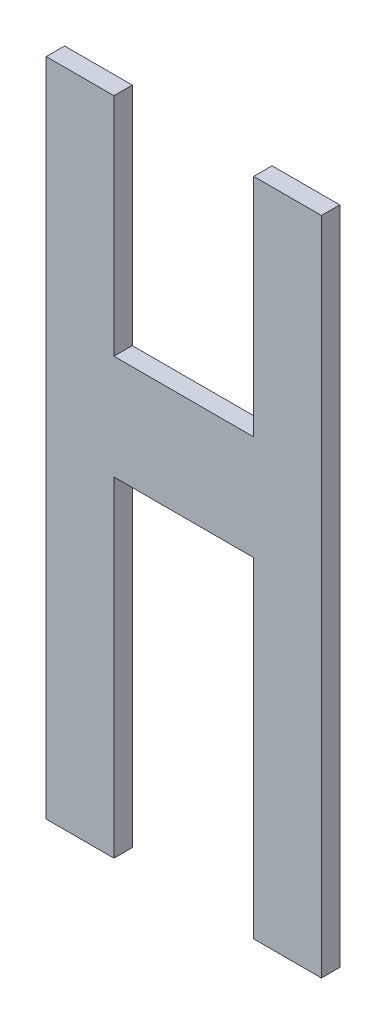
ISO-10303-21;
HEADER;
FILE_DESCRIPTION(('STEP AP214'),'2;1');
FILE_NAME('part.step','',(''),(''),'','','');
FILE_SCHEMA(('AUTOMOTIVE_DESIGN { 1 0 10303 214 1 1 1 1 }'));
ENDSEC;
DATA;
#1=APPLICATION_CONTEXT('core data for automotive mechanical design processes');
#2=APPLICATION_PROTOCOL_DEFINITION('international standard','automotive_design',2000,#1);
#3=PRODUCT_CONTEXT('',#1,'mechanical');
#4=PRODUCT('Part','Part','',(#3));
#5=PRODUCT_RELATED_PRODUCT_CATEGORY('part','',(#4));
#6=PRODUCT_DEFINITION_FORMATION('','',#4);
#7=PRODUCT_DEFINITION_CONTEXT('part definition',#1,'design');
#8=PRODUCT_DEFINITION('design','',#6,#7);
#9=PRODUCT_DEFINITION_SHAPE('','',#8);
#10=(LENGTH_UNIT() NAMED_UNIT(*) SI_UNIT(.MILLI.,.METRE.));
#11=(NAMED_UNIT(*) PLANE_ANGLE_UNIT() SI_UNIT($,.RADIAN.));
#12=(NAMED_UNIT(*) SI_UNIT($,.STERADIAN.) SOLID_ANGLE_UNIT());
#13=UNCERTAINTY_MEASURE_WITH_UNIT(LENGTH_MEASURE(1.E-05),#10,'distance_accuracy_value','');
#14=(GEOMETRIC_REPRESENTATION_CONTEXT(3) GLOBAL_UNCERTAINTY_ASSIGNED_CONTEXT((#13)) GLOBAL_UNIT_ASSIGNED_CONTEXT((#10,
#11,#12)) REPRESENTATION_CONTEXT('',''));
#15=CARTESIAN_POINT('',(0.,0.,0.));
#16=DIRECTION('',(0.,0.,1.));
#17=DIRECTION('',(1.,0.,0.));
#18=AXIS2_PLACEMENT_3D('',#15,#16,#17);
#19=CARTESIAN_POINT('',(-335.788761354376,508.440170454545,25.4));
#20=DIRECTION('',(0.,-1.,0.));
#21=DIRECTION('',(0.,0.,-1.));
#22=AXIS2_PLACEMENT_3D('',#19,#20,#21);
#23=PLANE('',#22);
#24=DIRECTION('',(-1.,0.,0.));
#25=VECTOR('',#24,1.);
#26=CARTESIAN_POINT('',(-335.788761354376,508.440170454545,0.));
#27=LINE('',#26,#25);
#28=CARTESIAN_POINT('',(-335.788761354376,508.440170454545,0.));
#29=VERTEX_POINT('',#28);
#30=CARTESIAN_POINT('',(-429.514761354376,508.440170454545,0.));
#31=VERTEX_POINT('',#30);
#32=EDGE_CURVE('E153',#29,#31,#27,.T.);
#33=ORIENTED_EDGE('',*,*,#32,.T.);
#34=DIRECTION('',(0.,0.,-1.));
#35=VECTOR('',#34,1.);
#36=CARTESIAN_POINT('',(-429.514761354376,508.440170454545,25.4));
#37=LINE('',#36,#35);
#38=CARTESIAN_POINT('',(-429.514761354376,508.440170454545,25.4));
#39=VERTEX_POINT('',#38);
#40=EDGE_CURVE('E11',#39,#31,#37,.T.);
#41=ORIENTED_EDGE('',*,*,#40,.F.);
#42=DIRECTION('',(-1.,0.,0.));
#43=VECTOR('',#42,1.);
#44=CARTESIAN_POINT('',(-335.788761354376,508.440170454545,25.4));
#45=LINE('',#44,#43);
#46=CARTESIAN_POINT('',(-335.788761354376,508.440170454545,25.4));
#47=VERTEX_POINT('',#46);
#48=EDGE_CURVE('E175',#47,#39,#45,.T.);
#49=ORIENTED_EDGE('',*,*,#48,.F.);
#50=DIRECTION('',(0.,0.,-1.));
#51=VECTOR('',#50,1.);
#52=CARTESIAN_POINT('',(-335.788761354376,508.440170454545,25.4));
#53=LINE('',#52,#51);
#54=EDGE_CURVE('E149',#47,#29,#53,.T.);
#55=ORIENTED_EDGE('',*,*,#54,.T.);
#56=EDGE_LOOP('',(#33,#41,#49,#55));
#57=FACE_BOUND('',#56,.T.);
#58=ADVANCED_FACE('F33',(#57),#23,.F.);
#59=CARTESIAN_POINT('',(-429.514761354376,508.440170454545,25.4));
#60=DIRECTION('',(1.,0.,0.));
#61=DIRECTION('',(0.,1.,0.));
#62=AXIS2_PLACEMENT_3D('',#59,#60,#61);
#63=PLANE('',#62);
#64=DIRECTION('',(0.,-1.,0.));
#65=VECTOR('',#64,1.);
#66=CARTESIAN_POINT('',(-429.514761354376,508.440170454545,0.));
#67=LINE('',#66,#65);
#68=CARTESIAN_POINT('',(-429.514761354376,-405.959829545455,0.));
#69=VERTEX_POINT('',#68);
#70=EDGE_CURVE('E156',#31,#69,#67,.T.);
#71=ORIENTED_EDGE('',*,*,#70,.T.);
#72=DIRECTION('',(0.,0.,-1.));
#73=VECTOR('',#72,1.);
#74=CARTESIAN_POINT('',(-429.514761354376,-405.959829545455,25.4));
#75=LINE('',#74,#73);
#76=CARTESIAN_POINT('',(-429.514761354376,-405.959829545455,25.4));
#77=VERTEX_POINT('',#76);
#78=EDGE_CURVE('E41',#77,#69,#75,.T.);
#79=ORIENTED_EDGE('',*,*,#78,.F.);
#80=DIRECTION('',(0.,-1.,0.));
#81=VECTOR('',#80,1.);
#82=CARTESIAN_POINT('',(-429.514761354376,508.440170454545,25.4));
#83=LINE('',#82,#81);
#84=EDGE_CURVE('E104',#39,#77,#83,.T.);
#85=ORIENTED_EDGE('',*,*,#84,.F.);
#86=ORIENTED_EDGE('',*,*,#40,.T.);
#87=EDGE_LOOP('',(#71,#79,#85,#86));
#88=FACE_BOUND('',#87,.T.);
#89=ADVANCED_FACE('F253',(#88),#63,.F.);
#90=CARTESIAN_POINT('',(-429.514761354376,-405.959829545455,25.4));
#91=DIRECTION('',(0.,1.,0.));
#92=DIRECTION('',(0.,0.,1.));
#93=AXIS2_PLACEMENT_3D('',#90,#91,#92);
#94=PLANE('',#93);
#95=DIRECTION('',(1.,0.,0.));
#96=VECTOR('',#95,1.);
#97=CARTESIAN_POINT('',(-429.514761354376,-405.959829545455,0.));
#98=LINE('',#97,#96);
#99=CARTESIAN_POINT('',(-335.788761354376,-405.959829545455,0.));
#100=VERTEX_POINT('',#99);
#101=EDGE_CURVE('E158',#69,#100,#98,.T.);
#102=ORIENTED_EDGE('',*,*,#101,.T.);
#103=DIRECTION('',(0.,0.,-1.));
#104=VECTOR('',#103,1.);
#105=CARTESIAN_POINT('',(-335.788761354376,-405.959829545455,25.4));
#106=LINE('',#105,#104);
#107=CARTESIAN_POINT('',(-335.788761354376,-405.959829545455,25.4));
#108=VERTEX_POINT('',#107);
#109=EDGE_CURVE('E194',#108,#100,#106,.T.);
#110=ORIENTED_EDGE('',*,*,#109,.F.);
#111=DIRECTION('',(1.,0.,0.));
#112=VECTOR('',#111,1.);
#113=CARTESIAN_POINT('',(-429.514761354376,-405.959829545455,25.4));
#114=LINE('',#113,#112);
#115=EDGE_CURVE('E202',#77,#108,#114,.T.);
#116=ORIENTED_EDGE('',*,*,#115,.F.);
#117=ORIENTED_EDGE('',*,*,#78,.T.);
#118=EDGE_LOOP('',(#102,#110,#116,#117));
#119=FACE_BOUND('',#118,.T.);
#120=ADVANCED_FACE('F200',(#119),#94,.F.);
#121=CARTESIAN_POINT('',(-335.788761354376,-405.959829545455,25.4));
#122=DIRECTION('',(-1.,0.,0.));
#123=DIRECTION('',(0.,0.,1.));
#124=AXIS2_PLACEMENT_3D('',#121,#122,#123);
#125=PLANE('',#124);
#126=DIRECTION('',(0.,1.,0.));
#127=VECTOR('',#126,1.);
#128=CARTESIAN_POINT('',(-335.788761354376,-405.959829545455,0.));
#129=LINE('',#128,#127);
#130=CARTESIAN_POINT('',(-335.788761354376,51.2401704545454,0.));
#131=VERTEX_POINT('',#130);
#132=EDGE_CURVE('E160',#100,#131,#129,.T.);
#133=ORIENTED_EDGE('',*,*,#132,.T.);
#134=DIRECTION('',(0.,0.,-1.));
#135=VECTOR('',#134,1.);
#136=CARTESIAN_POINT('',(-335.788761354376,51.2401704545454,25.4));
#137=LINE('',#136,#135);
#138=CARTESIAN_POINT('',(-335.788761354376,51.2401704545454,25.4));
#139=VERTEX_POINT('',#138);
#140=EDGE_CURVE('E191',#139,#131,#137,.T.);
#141=ORIENTED_EDGE('',*,*,#140,.F.);
#142=DIRECTION('',(0.,1.,0.));
#143=VECTOR('',#142,1.);
#144=CARTESIAN_POINT('',(-335.788761354376,-405.959829545455,25.4));
#145=LINE('',#144,#143);
#146=EDGE_CURVE('E220',#108,#139,#145,.T.);
#147=ORIENTED_EDGE('',*,*,#146,.F.);
#148=ORIENTED_EDGE('',*,*,#109,.T.);
#149=EDGE_LOOP('',(#133,#141,#147,#148));
#150=FACE_BOUND('',#149,.T.);
#151=ADVANCED_FACE('F211',(#150),#125,.F.);
#152=CARTESIAN_POINT('',(-335.788761354376,51.2401704545454,25.4));
#153=DIRECTION('',(0.,1.,0.));
#154=DIRECTION('',(0.,0.,1.));
#155=AXIS2_PLACEMENT_3D('',#152,#153,#154);
#156=PLANE('',#155);
#157=DIRECTION('',(1.,0.,0.));
#158=VECTOR('',#157,1.);
#159=CARTESIAN_POINT('',(-335.788761354376,51.2401704545454,0.));
#160=LINE('',#159,#158);
#161=CARTESIAN_POINT('',(-142.284056924376,51.2401704545454,0.));
#162=VERTEX_POINT('',#161);
#163=EDGE_CURVE('E162',#131,#162,#160,.T.);
#164=ORIENTED_EDGE('',*,*,#163,.T.);
#165=DIRECTION('',(0.,0.,-1.));
#166=VECTOR('',#165,1.);
#167=CARTESIAN_POINT('',(-142.284056924376,51.2401704545454,25.4));
#168=LINE('',#167,#166);
#169=CARTESIAN_POINT('',(-142.284056924376,51.2401704545454,25.4));
#170=VERTEX_POINT('',#169);
#171=EDGE_CURVE('E188',#170,#162,#168,.T.);
#172=ORIENTED_EDGE('',*,*,#171,.F.);
#173=DIRECTION('',(1.,0.,0.));
#174=VECTOR('',#173,1.);
#175=CARTESIAN_POINT('',(-335.788761354376,51.2401704545454,25.4));
#176=LINE('',#175,#174);
#177=EDGE_CURVE('E217',#139,#170,#176,.T.);
#178=ORIENTED_EDGE('',*,*,#177,.F.);
#179=ORIENTED_EDGE('',*,*,#140,.T.);
#180=EDGE_LOOP('',(#164,#172,#178,#179));
#181=FACE_BOUND('',#180,.T.);
#182=ADVANCED_FACE('F215',(#181),#156,.F.);
#183=CARTESIAN_POINT('',(-142.284056924376,51.2401704545454,25.4));
#184=DIRECTION('',(1.,0.,0.));
#185=DIRECTION('',(0.,0.,-1.));
#186=AXIS2_PLACEMENT_3D('',#183,#184,#185);
#187=PLANE('',#186);
#188=DIRECTION('',(0.,-1.,0.));
#189=VECTOR('',#188,1.);
#190=CARTESIAN_POINT('',(-142.284056924376,51.2401704545454,0.));
#191=LINE('',#190,#189);
#192=CARTESIAN_POINT('',(-142.284056924376,-405.959829545455,0.));
#193=VERTEX_POINT('',#192);
#194=EDGE_CURVE('E164',#162,#193,#191,.T.);
#195=ORIENTED_EDGE('',*,*,#194,.T.);
#196=DIRECTION('',(0.,0.,-1.));
#197=VECTOR('',#196,1.);
#198=CARTESIAN_POINT('',(-142.284056924376,-405.959829545455,25.4));
#199=LINE('',#198,#197);
#200=CARTESIAN_POINT('',(-142.284056924376,-405.959829545455,25.4));
#201=VERTEX_POINT('',#200);
#202=EDGE_CURVE('E185',#201,#193,#199,.T.);
#203=ORIENTED_EDGE('',*,*,#202,.F.);
#204=DIRECTION('',(0.,-1.,0.));
#205=VECTOR('',#204,1.);
#206=CARTESIAN_POINT('',(-142.284056924376,51.2401704545454,25.4));
#207=LINE('',#206,#205);
#208=EDGE_CURVE('E219',#170,#201,#207,.T.);
#209=ORIENTED_EDGE('',*,*,#208,.F.);
#210=ORIENTED_EDGE('',*,*,#171,.T.);
#211=EDGE_LOOP('',(#195,#203,#209,#210));
#212=FACE_BOUND('',#211,.T.);
#213=ADVANCED_FACE('F266',(#212),#187,.F.);
#214=CARTESIAN_POINT('',(-142.284056924376,-405.959829545455,25.4));
#215=DIRECTION('',(0.,1.,0.));
#216=DIRECTION('',(0.,0.,1.));
#217=AXIS2_PLACEMENT_3D('',#214,#215,#216);
#218=PLANE('',#217);
#219=DIRECTION('',(1.,0.,0.));
#220=VECTOR('',#219,1.);
#221=CARTESIAN_POINT('',(-142.284056924376,-405.959829545455,0.));
#222=LINE('',#221,#220);
#223=CARTESIAN_POINT('',(-48.5147613543761,-405.959829545455,0.));
#224=VERTEX_POINT('',#223);
#225=EDGE_CURVE('E166',#193,#224,#222,.T.);
#226=ORIENTED_EDGE('',*,*,#225,.T.);
#227=DIRECTION('',(0.,0.,-1.));
#228=VECTOR('',#227,1.);
#229=CARTESIAN_POINT('',(-48.5147613543761,-405.959829545455,25.4));
#230=LINE('',#229,#228);
#231=CARTESIAN_POINT('',(-48.5147613543761,-405.959829545455,25.4));
#232=VERTEX_POINT('',#231);
#233=EDGE_CURVE('E182',#232,#224,#230,.T.);
#234=ORIENTED_EDGE('',*,*,#233,.F.);
#235=DIRECTION('',(1.,0.,0.));
#236=VECTOR('',#235,1.);
#237=CARTESIAN_POINT('',(-142.284056924376,-405.959829545455,25.4));
#238=LINE('',#237,#236);
#239=EDGE_CURVE('E222',#201,#232,#238,.T.);
#240=ORIENTED_EDGE('',*,*,#239,.F.);
#241=ORIENTED_EDGE('',*,*,#202,.T.);
#242=EDGE_LOOP('',(#226,#234,#240,#241));
#243=FACE_BOUND('',#242,.T.);
#244=ADVANCED_FACE('F269',(#243),#218,.F.);
#245=CARTESIAN_POINT('',(-48.5147613543761,-405.959829545455,25.4));
#246=DIRECTION('',(-1.,0.,0.));
#247=DIRECTION('',(0.,0.,1.));
#248=AXIS2_PLACEMENT_3D('',#245,#246,#247);
#249=PLANE('',#248);
#250=DIRECTION('',(0.,1.,0.));
#251=VECTOR('',#250,1.);
#252=CARTESIAN_POINT('',(-48.5147613543761,-405.959829545455,0.));
#253=LINE('',#252,#251);
#254=CARTESIAN_POINT('',(-48.5147613543761,508.440170454545,0.));
#255=VERTEX_POINT('',#254);
#256=EDGE_CURVE('E168',#224,#255,#253,.T.);
#257=ORIENTED_EDGE('',*,*,#256,.T.);
#258=DIRECTION('',(0.,0.,-1.));
#259=VECTOR('',#258,1.);
#260=CARTESIAN_POINT('',(-48.5147613543761,508.440170454545,25.4));
#261=LINE('',#260,#259);
#262=CARTESIAN_POINT('',(-48.5147613543761,508.440170454545,25.4));
#263=VERTEX_POINT('',#262);
#264=EDGE_CURVE('E179',#263,#255,#261,.T.);
#265=ORIENTED_EDGE('',*,*,#264,.F.);
#266=DIRECTION('',(0.,1.,0.));
#267=VECTOR('',#266,1.);
#268=CARTESIAN_POINT('',(-48.5147613543761,-405.959829545455,25.4));
#269=LINE('',#268,#267);
#270=EDGE_CURVE('E228',#232,#263,#269,.T.);
#271=ORIENTED_EDGE('',*,*,#270,.F.);
#272=ORIENTED_EDGE('',*,*,#233,.T.);
#273=EDGE_LOOP('',(#257,#265,#271,#272));
#274=FACE_BOUND('',#273,.T.);
#275=ADVANCED_FACE('F234',(#274),#249,.F.);
#276=CARTESIAN_POINT('',(-48.5147613543761,508.440170454545,25.4));
#277=DIRECTION('',(0.,-1.,0.));
#278=DIRECTION('',(0.,0.,-1.));
#279=AXIS2_PLACEMENT_3D('',#276,#277,#278);
#280=PLANE('',#279);
#281=DIRECTION('',(-1.,0.,0.));
#282=VECTOR('',#281,1.);
#283=CARTESIAN_POINT('',(-48.5147613543761,508.440170454545,0.));
#284=LINE('',#283,#282);
#285=CARTESIAN_POINT('',(-142.284056924376,508.440170454545,0.));
#286=VERTEX_POINT('',#285);
#287=EDGE_CURVE('E170',#255,#286,#284,.T.);
#288=ORIENTED_EDGE('',*,*,#287,.T.);
#289=DIRECTION('',(0.,0.,-1.));
#290=VECTOR('',#289,1.);
#291=CARTESIAN_POINT('',(-142.284056924376,508.440170454545,25.4));
#292=LINE('',#291,#290);
#293=CARTESIAN_POINT('',(-142.284056924376,508.440170454545,25.4));
#294=VERTEX_POINT('',#293);
#295=EDGE_CURVE('E144',#294,#286,#292,.T.);
#296=ORIENTED_EDGE('',*,*,#295,.F.);
#297=DIRECTION('',(-1.,0.,0.));
#298=VECTOR('',#297,1.);
#299=CARTESIAN_POINT('',(-48.5147613543761,508.440170454545,25.4));
#300=LINE('',#299,#298);
#301=EDGE_CURVE('E135',#263,#294,#300,.T.);
#302=ORIENTED_EDGE('',*,*,#301,.F.);
#303=ORIENTED_EDGE('',*,*,#264,.T.);
#304=EDGE_LOOP('',(#288,#296,#302,#303));
#305=FACE_BOUND('',#304,.T.);
#306=ADVANCED_FACE('F238',(#305),#280,.F.);
#307=CARTESIAN_POINT('',(-142.284056924376,508.440170454545,25.4));
#308=DIRECTION('',(1.,0.,0.));
#309=DIRECTION('',(0.,0.,-1.));
#310=AXIS2_PLACEMENT_3D('',#307,#308,#309);
#311=PLANE('',#310);
#312=DIRECTION('',(0.,-1.,0.));
#313=VECTOR('',#312,1.);
#314=CARTESIAN_POINT('',(-142.284056924376,508.440170454545,0.));
#315=LINE('',#314,#313);
#316=CARTESIAN_POINT('',(-142.284056924376,196.020170454545,0.));
#317=VERTEX_POINT('',#316);
#318=EDGE_CURVE('E143',#286,#317,#315,.T.);
#319=ORIENTED_EDGE('',*,*,#318,.T.);
#320=DIRECTION('',(0.,0.,-1.));
#321=VECTOR('',#320,1.);
#322=CARTESIAN_POINT('',(-142.284056924376,196.020170454545,25.4));
#323=LINE('',#322,#321);
#324=CARTESIAN_POINT('',(-142.284056924376,196.020170454545,25.4));
#325=VERTEX_POINT('',#324);
#326=EDGE_CURVE('E140',#325,#317,#323,.T.);
#327=ORIENTED_EDGE('',*,*,#326,.F.);
#328=DIRECTION('',(0.,-1.,0.));
#329=VECTOR('',#328,1.);
#330=CARTESIAN_POINT('',(-142.284056924376,508.440170454545,25.4));
#331=LINE('',#330,#329);
#332=EDGE_CURVE('E129',#294,#325,#331,.T.);
#333=ORIENTED_EDGE('',*,*,#332,.F.);
#334=ORIENTED_EDGE('',*,*,#295,.T.);
#335=EDGE_LOOP('',(#319,#327,#333,#334));
#336=FACE_BOUND('',#335,.T.);
#337=ADVANCED_FACE('F141',(#336),#311,.F.);
#338=CARTESIAN_POINT('',(-142.284056924376,196.020170454545,25.4));
#339=DIRECTION('',(0.,-1.,0.));
#340=DIRECTION('',(1.,0.,0.));
#341=AXIS2_PLACEMENT_3D('',#338,#339,#340);
#342=PLANE('',#341);
#343=DIRECTION('',(-1.,0.,0.));
#344=VECTOR('',#343,1.);
#345=CARTESIAN_POINT('',(-142.284056924376,196.020170454545,0.));
#346=LINE('',#345,#344);
#347=CARTESIAN_POINT('',(-335.788761354376,196.020170454545,0.));
#348=VERTEX_POINT('',#347);
#349=EDGE_CURVE('E90',#317,#348,#346,.T.);
#350=ORIENTED_EDGE('',*,*,#349,.T.);
#351=DIRECTION('',(0.,0.,-1.));
#352=VECTOR('',#351,1.);
#353=CARTESIAN_POINT('',(-335.788761354376,196.020170454545,25.4));
#354=LINE('',#353,#352);
#355=CARTESIAN_POINT('',(-335.788761354376,196.020170454545,25.4));
#356=VERTEX_POINT('',#355);
#357=EDGE_CURVE('E145',#356,#348,#354,.T.);
#358=ORIENTED_EDGE('',*,*,#357,.F.);
#359=DIRECTION('',(-1.,0.,0.));
#360=VECTOR('',#359,1.);
#361=CARTESIAN_POINT('',(-142.284056924376,196.020170454545,25.4));
#362=LINE('',#361,#360);
#363=EDGE_CURVE('E133',#325,#356,#362,.T.);
#364=ORIENTED_EDGE('',*,*,#363,.F.);
#365=ORIENTED_EDGE('',*,*,#326,.T.);
#366=EDGE_LOOP('',(#350,#358,#364,#365));
#367=FACE_BOUND('',#366,.T.);
#368=ADVANCED_FACE('F147',(#367),#342,.F.);
#369=CARTESIAN_POINT('',(-335.788761354376,196.020170454545,25.4));
#370=DIRECTION('',(-1.,0.,0.));
#371=DIRECTION('',(0.,0.,1.));
#372=AXIS2_PLACEMENT_3D('',#369,#370,#371);
#373=PLANE('',#372);
#374=DIRECTION('',(0.,1.,0.));
#375=VECTOR('',#374,1.);
#376=CARTESIAN_POINT('',(-335.788761354376,196.020170454545,0.));
#377=LINE('',#376,#375);
#378=EDGE_CURVE('E96',#348,#29,#377,.T.);
#379=ORIENTED_EDGE('',*,*,#378,.T.);
#380=ORIENTED_EDGE('',*,*,#54,.F.);
#381=DIRECTION('',(0.,1.,0.));
#382=VECTOR('',#381,1.);
#383=CARTESIAN_POINT('',(-335.788761354376,196.020170454545,25.4));
#384=LINE('',#383,#382);
#385=EDGE_CURVE('E49',#356,#47,#384,.T.);
#386=ORIENTED_EDGE('',*,*,#385,.F.);
#387=ORIENTED_EDGE('',*,*,#357,.T.);
#388=EDGE_LOOP('',(#379,#380,#386,#387));
#389=FACE_BOUND('',#388,.T.);
#390=ADVANCED_FACE('F242',(#389),#373,.F.);
#391=CARTESIAN_POINT('',(0.,0.,25.4));
#392=DIRECTION('',(0.,0.,1.));
#393=DIRECTION('',(1.,0.,0.));
#394=AXIS2_PLACEMENT_3D('',#391,#392,#393);
#395=PLANE('',#394);
#396=ORIENTED_EDGE('',*,*,#48,.T.);
#397=ORIENTED_EDGE('',*,*,#84,.T.);
#398=ORIENTED_EDGE('',*,*,#115,.T.);
#399=ORIENTED_EDGE('',*,*,#146,.T.);
#400=ORIENTED_EDGE('',*,*,#177,.T.);
#401=ORIENTED_EDGE('',*,*,#208,.T.);
#402=ORIENTED_EDGE('',*,*,#239,.T.);
#403=ORIENTED_EDGE('',*,*,#270,.T.);
#404=ORIENTED_EDGE('',*,*,#301,.T.);
#405=ORIENTED_EDGE('',*,*,#332,.T.);
#406=ORIENTED_EDGE('',*,*,#363,.T.);
#407=ORIENTED_EDGE('',*,*,#385,.T.);
#408=EDGE_LOOP('',(#396,#397,#398,#399,#400,#401,#402,#403,#404,#405,#406,#407));
#409=FACE_BOUND('',#408,.T.);
#410=ADVANCED_FACE('F131',(#409),#395,.T.);
#411=CARTESIAN_POINT('',(0.,0.,0.));
#412=DIRECTION('',(0.,0.,1.));
#413=DIRECTION('',(1.,0.,0.));
#414=AXIS2_PLACEMENT_3D('',#411,#412,#413);
#415=PLANE('',#414);
#416=ORIENTED_EDGE('',*,*,#32,.F.);
#417=ORIENTED_EDGE('',*,*,#378,.F.);
#418=ORIENTED_EDGE('',*,*,#349,.F.);
#419=ORIENTED_EDGE('',*,*,#318,.F.);
#420=ORIENTED_EDGE('',*,*,#287,.F.);
#421=ORIENTED_EDGE('',*,*,#256,.F.);
#422=ORIENTED_EDGE('',*,*,#225,.F.);
#423=ORIENTED_EDGE('',*,*,#194,.F.);
#424=ORIENTED_EDGE('',*,*,#163,.F.);
#425=ORIENTED_EDGE('',*,*,#132,.F.);
#426=ORIENTED_EDGE('',*,*,#101,.F.);
#427=ORIENTED_EDGE('',*,*,#70,.F.);
#428=EDGE_LOOP('',(#416,#417,#418,#419,#420,#421,#422,#423,#424,#425,#426,#427));
#429=FACE_BOUND('',#428,.T.);
#430=ADVANCED_FACE('F206',(#429),#415,.F.);
#431=CLOSED_SHELL('',(#58,#89,#120,#151,#182,#213,#244,#275,#306,#337,#368,#390,#410,#430));
#432=MANIFOLD_SOLID_BREP('B2',#431);
#433=ADVANCED_BREP_SHAPE_REPRESENTATION('',(#18,#432),#14);
#434=SHAPE_DEFINITION_REPRESENTATION(#9,#433);
ENDSEC;
END-ISO-10303-21;
